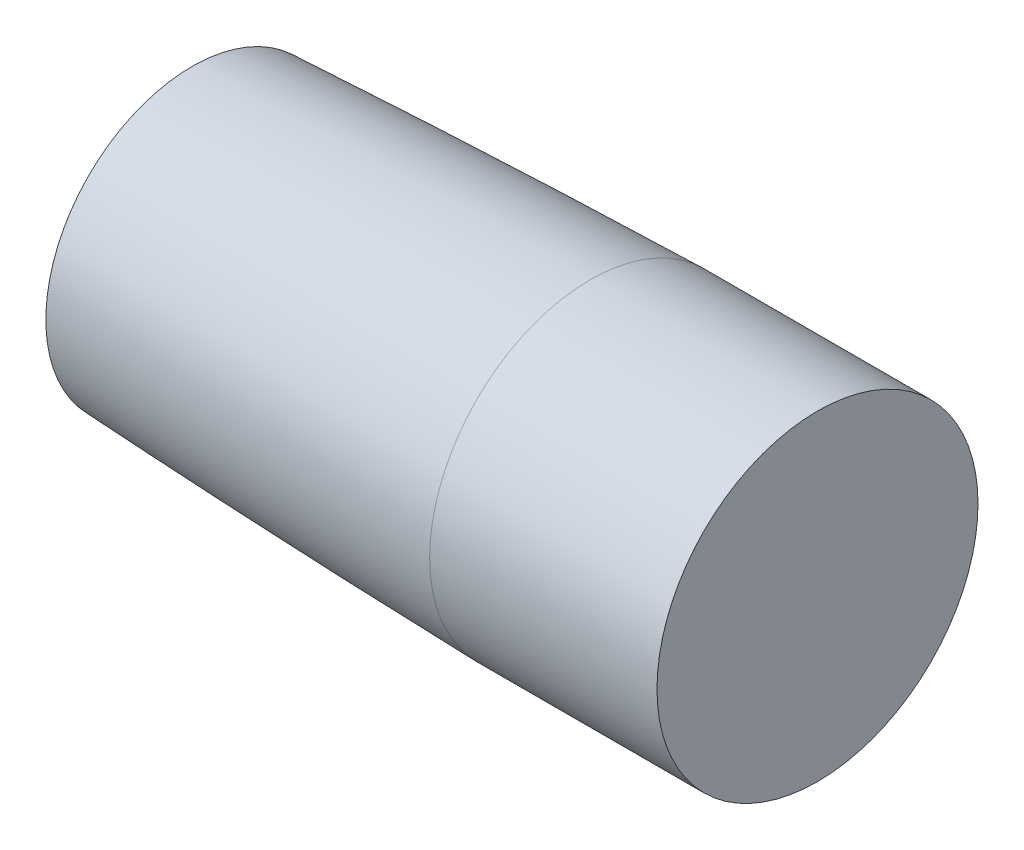
ISO-10303-21;
HEADER;
FILE_DESCRIPTION(('STEP AP214'),'2;1');
FILE_NAME('part.step','',(''),(''),'','','');
FILE_SCHEMA(('AUTOMOTIVE_DESIGN { 1 0 10303 214 1 1 1 1 }'));
ENDSEC;
DATA;
#1=APPLICATION_CONTEXT('core data for automotive mechanical design processes');
#2=APPLICATION_PROTOCOL_DEFINITION('international standard','automotive_design',2000,#1);
#3=PRODUCT_CONTEXT('',#1,'mechanical');
#4=PRODUCT('Part','Part','',(#3));
#5=PRODUCT_RELATED_PRODUCT_CATEGORY('part','',(#4));
#6=PRODUCT_DEFINITION_FORMATION('','',#4);
#7=PRODUCT_DEFINITION_CONTEXT('part definition',#1,'design');
#8=PRODUCT_DEFINITION('design','',#6,#7);
#9=PRODUCT_DEFINITION_SHAPE('','',#8);
#10=(LENGTH_UNIT() NAMED_UNIT(*) SI_UNIT(.MILLI.,.METRE.));
#11=(NAMED_UNIT(*) PLANE_ANGLE_UNIT() SI_UNIT($,.RADIAN.));
#12=(NAMED_UNIT(*) SI_UNIT($,.STERADIAN.) SOLID_ANGLE_UNIT());
#13=UNCERTAINTY_MEASURE_WITH_UNIT(LENGTH_MEASURE(1.E-05),#10,'distance_accuracy_value','');
#14=(GEOMETRIC_REPRESENTATION_CONTEXT(3) GLOBAL_UNCERTAINTY_ASSIGNED_CONTEXT((#13)) GLOBAL_UNIT_ASSIGNED_CONTEXT((#10,
#11,#12)) REPRESENTATION_CONTEXT('',''));
#15=CARTESIAN_POINT('',(0.,0.,0.));
#16=DIRECTION('',(0.,0.,1.));
#17=DIRECTION('',(1.,0.,0.));
#18=AXIS2_PLACEMENT_3D('',#15,#16,#17);
#19=CARTESIAN_POINT('',(490.969999999369,0.,-47.8009847002458));
#20=CARTESIAN_POINT('',(490.119904256047,0.,-47.7814276763497));
#21=CARTESIAN_POINT('',(488.44678287165,0.,-47.742316661309));
#22=CARTESIAN_POINT('',(484.034315216106,0.,-47.6377050535225));
#23=CARTESIAN_POINT('',(479.399474140002,0.,-47.52063335993));
#24=CARTESIAN_POINT('',(472.35723134524,0.,-47.3378584430789));
#25=CARTESIAN_POINT('',(465.238945097029,0.,-47.1381625567757));
#26=CARTESIAN_POINT('',(456.867468272548,0.,-46.8921104856082));
#27=CARTESIAN_POINT('',(448.841670657308,0.,-46.639557013532));
#28=CARTESIAN_POINT('',(440.616250238959,0.,-46.3682702095618));
#29=CARTESIAN_POINT('',(432.505238250567,0.,-46.0850111312682));
#30=CARTESIAN_POINT('',(424.336527511026,0.,-45.7865614076576));
#31=CARTESIAN_POINT('',(416.185500170918,0.,-45.4733516274679));
#32=CARTESIAN_POINT('',(408.312611991045,0.,-45.1578460506602));
#33=CARTESIAN_POINT('',(401.394253178944,0.,-44.867843930654));
#34=CARTESIAN_POINT('',(395.609607151688,0.,-44.618105901277));
#35=CARTESIAN_POINT('',(390.662889882869,0.,-44.3979946394376));
#36=CARTESIAN_POINT('',(386.793767835841,0.,-44.223555396339));
#37=CARTESIAN_POINT('',(382.338814458592,0.,-44.0167092210789));
#38=CARTESIAN_POINT('',(378.947630502463,0.,-43.8582398499949));
#39=CARTESIAN_POINT('',(374.969174696642,0.,-43.6663670245867));
#40=CARTESIAN_POINT('',(373.249304537836,0.,-43.5828342078604));
#41=CARTESIAN_POINT('',(372.399999999375,0.,-43.5412761802224));
#42=B_SPLINE_CURVE_WITH_KNOTS('',4,(#19,#20,#21,#22,#23,#24,#25,#26,#27,#28,#29,#30,#31,#32,#33,
#34,#35,#36,#37,#38,#39,#40,#41),.UNSPECIFIED.,.F.,.F.,(5,1,1,1,1,1,1,1,1,1,1,1,1,1,1,1,1,1,1,
5),(0.0826164706283773,0.11128304657078,0.139949622622926,0.178523030180843,0.235856182235221,
0.293189334376671,0.350522486417625,0.407855638544425,0.465188790613436,0.522521942694805,
0.579855094830639,0.637188246858494,0.694521399007838,0.744635211098473,0.7733017871041,
0.801968363070622,0.830634939291368,0.859301515203392,0.887968091217568,0.916634667500208),.UNSPECIFIED.);
#43=CARTESIAN_POINT('',(558.670000000096,0.,-4.71844785465692E-13));
#44=DIRECTION('',(1.,0.,0.));
#45=AXIS1_PLACEMENT('',#43,#44);
#46=SURFACE_OF_REVOLUTION('',#42,#45);
#47=CARTESIAN_POINT('',(372.400000001128,0.,0.));
#48=DIRECTION('',(1.,0.,0.));
#49=DIRECTION('',(0.,0.,-1.));
#50=AXIS2_PLACEMENT_3D('',#47,#48,#49);
#51=CIRCLE('',#50,43.5412761803081);
#52=CARTESIAN_POINT('',(372.400000001128,0.,-43.5412761803081));
#53=VERTEX_POINT('',#52);
#54=EDGE_CURVE('E10',#53,#53,#51,.T.);
#55=ORIENTED_EDGE('',*,*,#54,.T.);
#56=EDGE_LOOP('',(#55));
#57=FACE_BOUND('',#56,.T.);
#58=CARTESIAN_POINT('',(490.970000001123,0.,-3.00603094985367E-13));
#59=DIRECTION('',(1.,0.,0.));
#60=DIRECTION('',(0.,0.,-1.));
#61=AXIS2_PLACEMENT_3D('',#58,#59,#60);
#62=CIRCLE('',#61,47.8009847002873);
#63=CARTESIAN_POINT('',(490.970000001123,0.,-47.8009847002876));
#64=VERTEX_POINT('',#63);
#65=EDGE_CURVE('E56',#64,#64,#62,.T.);
#66=ORIENTED_EDGE('',*,*,#65,.F.);
#67=EDGE_LOOP('',(#66));
#68=FACE_BOUND('',#67,.T.);
#69=ADVANCED_FACE('F43',(#57,#68),#46,.F.);
#70=CARTESIAN_POINT('',(372.400000001128,0.,0.));
#71=DIRECTION('',(-1.,0.,0.));
#72=DIRECTION('',(0.,0.,1.));
#73=AXIS2_PLACEMENT_3D('',#70,#71,#72);
#74=PLANE('',#73);
#75=CARTESIAN_POINT('',(372.400000001128,0.,-9.41955768626786E-13));
#76=DIRECTION('',(-1.,0.,0.));
#77=DIRECTION('',(0.,0.,1.));
#78=AXIS2_PLACEMENT_3D('',#75,#76,#77);
#79=CIRCLE('',#78,12.7);
#80=CARTESIAN_POINT('',(372.400000001128,0.,12.6999999999991));
#81=VERTEX_POINT('',#80);
#82=EDGE_CURVE('E67',#81,#81,#79,.T.);
#83=ORIENTED_EDGE('',*,*,#82,.F.);
#84=EDGE_LOOP('',(#83));
#85=FACE_BOUND('',#84,.T.);
#86=ORIENTED_EDGE('',*,*,#54,.F.);
#87=EDGE_LOOP('',(#86));
#88=FACE_BOUND('',#87,.T.);
#89=ADVANCED_FACE('F87',(#85,#88),#74,.T.);
#90=CARTESIAN_POINT('',(558.670000000096,0.,-47.8009847002876));
#91=DIRECTION('',(1.,0.,0.));
#92=DIRECTION('',(0.,0.,-1.));
#93=AXIS2_PLACEMENT_3D('',#90,#91,#92);
#94=PLANE('',#93);
#95=CARTESIAN_POINT('',(558.670000000096,0.,-4.71844785465692E-13));
#96=DIRECTION('',(1.,0.,0.));
#97=DIRECTION('',(0.,0.,-1.));
#98=AXIS2_PLACEMENT_3D('',#95,#96,#97);
#99=CIRCLE('',#98,47.8009847002871);
#100=CARTESIAN_POINT('',(558.670000000096,0.,-47.8009847002876));
#101=VERTEX_POINT('',#100);
#102=EDGE_CURVE('E51',#101,#101,#99,.T.);
#103=ORIENTED_EDGE('',*,*,#102,.T.);
#104=EDGE_LOOP('',(#103));
#105=FACE_BOUND('',#104,.T.);
#106=ADVANCED_FACE('F90',(#105),#94,.T.);
#107=CARTESIAN_POINT('',(558.670000000096,0.,-4.71844785465692E-13));
#108=DIRECTION('',(1.,0.,0.));
#109=DIRECTION('',(0.,0.,-1.));
#110=AXIS2_PLACEMENT_3D('',#107,#108,#109);
#111=CYLINDRICAL_SURFACE('',#110,47.8009847002872);
#112=ORIENTED_EDGE('',*,*,#65,.T.);
#113=EDGE_LOOP('',(#112));
#114=FACE_BOUND('',#113,.T.);
#115=ORIENTED_EDGE('',*,*,#102,.F.);
#116=EDGE_LOOP('',(#115));
#117=FACE_BOUND('',#116,.T.);
#118=ADVANCED_FACE('F83',(#114,#117),#111,.T.);
#119=CARTESIAN_POINT('',(423.200000001128,0.,-1.07045027197291E-12));
#120=DIRECTION('',(-1.,0.,0.));
#121=DIRECTION('',(0.,0.,1.));
#122=AXIS2_PLACEMENT_3D('',#119,#120,#121);
#123=CYLINDRICAL_SURFACE('',#122,12.7);
#124=CARTESIAN_POINT('',(423.200000001128,0.,-1.07045027197291E-12));
#125=DIRECTION('',(-1.,0.,0.));
#126=DIRECTION('',(0.,0.,1.));
#127=AXIS2_PLACEMENT_3D('',#124,#125,#126);
#128=CIRCLE('',#127,12.7);
#129=CARTESIAN_POINT('',(423.200000001128,0.,12.6999999999989));
#130=VERTEX_POINT('',#129);
#131=EDGE_CURVE('E61',#130,#130,#128,.T.);
#132=ORIENTED_EDGE('',*,*,#131,.F.);
#133=EDGE_LOOP('',(#132));
#134=FACE_BOUND('',#133,.T.);
#135=ORIENTED_EDGE('',*,*,#82,.T.);
#136=EDGE_LOOP('',(#135));
#137=FACE_BOUND('',#136,.T.);
#138=ADVANCED_FACE('F80',(#134,#137),#123,.F.);
#139=CARTESIAN_POINT('',(423.200000001128,0.,-1.07045027197291E-12));
#140=DIRECTION('',(-1.,0.,0.));
#141=DIRECTION('',(0.,0.,1.));
#142=AXIS2_PLACEMENT_3D('',#139,#140,#141);
#143=PLANE('',#142);
#144=ORIENTED_EDGE('',*,*,#131,.T.);
#145=EDGE_LOOP('',(#144));
#146=FACE_BOUND('',#145,.T.);
#147=ADVANCED_FACE('F78',(#146),#143,.T.);
#148=CLOSED_SHELL('',(#69,#89,#106,#118,#138,#147));
#149=MANIFOLD_SOLID_BREP('B2',#148);
#150=ADVANCED_BREP_SHAPE_REPRESENTATION('',(#18,#149),#14);
#151=SHAPE_DEFINITION_REPRESENTATION(#9,#150);
ENDSEC;
END-ISO-10303-21;
